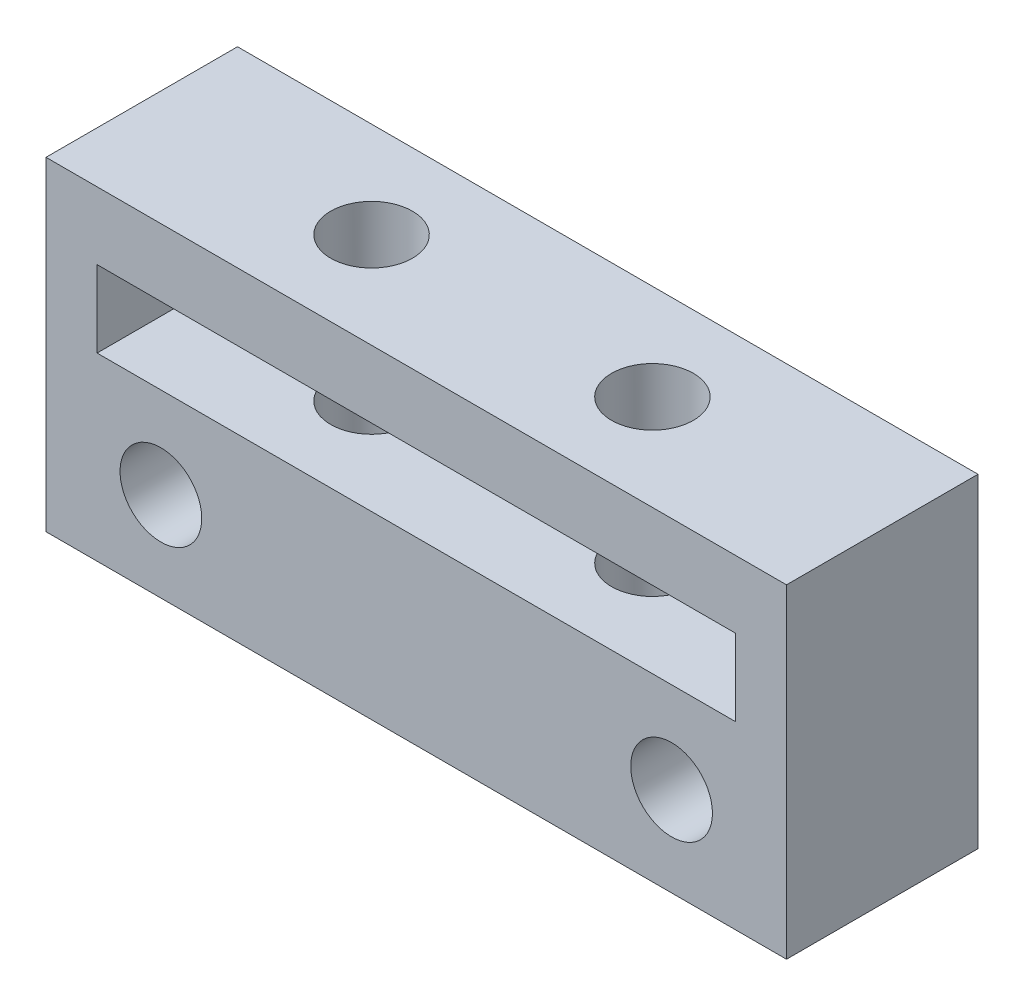
ISO-10303-21;
HEADER;
FILE_DESCRIPTION(('STEP AP214'),'2;1');
FILE_NAME('part.step','',(''),(''),'','','');
FILE_SCHEMA(('AUTOMOTIVE_DESIGN { 1 0 10303 214 1 1 1 1 }'));
ENDSEC;
DATA;
#1=APPLICATION_CONTEXT('core data for automotive mechanical design processes');
#2=APPLICATION_PROTOCOL_DEFINITION('international standard','automotive_design',2000,#1);
#3=PRODUCT_CONTEXT('',#1,'mechanical');
#4=PRODUCT('Part','Part','',(#3));
#5=PRODUCT_RELATED_PRODUCT_CATEGORY('part','',(#4));
#6=PRODUCT_DEFINITION_FORMATION('','',#4);
#7=PRODUCT_DEFINITION_CONTEXT('part definition',#1,'design');
#8=PRODUCT_DEFINITION('design','',#6,#7);
#9=PRODUCT_DEFINITION_SHAPE('','',#8);
#10=(LENGTH_UNIT() NAMED_UNIT(*) SI_UNIT(.MILLI.,.METRE.));
#11=(NAMED_UNIT(*) PLANE_ANGLE_UNIT() SI_UNIT($,.RADIAN.));
#12=(NAMED_UNIT(*) SI_UNIT($,.STERADIAN.) SOLID_ANGLE_UNIT());
#13=UNCERTAINTY_MEASURE_WITH_UNIT(LENGTH_MEASURE(1.E-05),#10,'distance_accuracy_value','');
#14=(GEOMETRIC_REPRESENTATION_CONTEXT(3) GLOBAL_UNCERTAINTY_ASSIGNED_CONTEXT((#13)) GLOBAL_UNIT_ASSIGNED_CONTEXT((#10,
#11,#12)) REPRESENTATION_CONTEXT('',''));
#15=CARTESIAN_POINT('',(0.,0.,0.));
#16=DIRECTION('',(0.,0.,1.));
#17=DIRECTION('',(1.,0.,0.));
#18=AXIS2_PLACEMENT_3D('',#15,#16,#17);
#19=CARTESIAN_POINT('',(5.5,9.6,3.75));
#20=DIRECTION('',(0.,-1.,0.));
#21=DIRECTION('',(0.,0.,-1.));
#22=AXIS2_PLACEMENT_3D('',#19,#20,#21);
#23=CYLINDRICAL_SURFACE('',#22,1.6);
#24=CARTESIAN_POINT('',(5.5,-2.53948169979873,3.75));
#25=DIRECTION('',(0.,-1.,0.));
#26=DIRECTION('',(0.,0.,-1.));
#27=AXIS2_PLACEMENT_3D('',#24,#25,#26);
#28=CIRCLE('',#27,1.6);
#29=CARTESIAN_POINT('',(5.5,-2.53948169979873,2.15));
#30=VERTEX_POINT('',#29);
#31=EDGE_CURVE('E134',#30,#30,#28,.T.);
#32=ORIENTED_EDGE('',*,*,#31,.F.);
#33=EDGE_LOOP('',(#32));
#34=FACE_BOUND('',#33,.T.);
#35=CARTESIAN_POINT('',(5.5,-8.1,3.75));
#36=DIRECTION('',(0.,-1.,0.));
#37=DIRECTION('',(0.,0.,-1.));
#38=AXIS2_PLACEMENT_3D('',#35,#36,#37);
#39=CIRCLE('',#38,1.6);
#40=CARTESIAN_POINT('',(5.5,-8.1,2.15));
#41=VERTEX_POINT('',#40);
#42=EDGE_CURVE('E217',#41,#41,#39,.T.);
#43=ORIENTED_EDGE('',*,*,#42,.T.);
#44=EDGE_LOOP('',(#43));
#45=FACE_BOUND('',#44,.T.);
#46=ADVANCED_FACE('F33',(#34,#45),#23,.F.);
#47=CARTESIAN_POINT('',(-5.5,9.6,3.75));
#48=DIRECTION('',(0.,-1.,0.));
#49=DIRECTION('',(0.,0.,-1.));
#50=AXIS2_PLACEMENT_3D('',#47,#48,#49);
#51=CYLINDRICAL_SURFACE('',#50,1.6);
#52=CARTESIAN_POINT('',(-5.5,-2.53948169979873,3.75));
#53=DIRECTION('',(0.,-1.,0.));
#54=DIRECTION('',(0.,0.,-1.));
#55=AXIS2_PLACEMENT_3D('',#52,#53,#54);
#56=CIRCLE('',#55,1.6);
#57=CARTESIAN_POINT('',(-5.5,-2.53948169979873,2.15));
#58=VERTEX_POINT('',#57);
#59=EDGE_CURVE('E133',#58,#58,#56,.T.);
#60=ORIENTED_EDGE('',*,*,#59,.F.);
#61=EDGE_LOOP('',(#60));
#62=FACE_BOUND('',#61,.T.);
#63=CARTESIAN_POINT('',(-5.5,-8.1,3.75));
#64=DIRECTION('',(0.,-1.,0.));
#65=DIRECTION('',(0.,0.,-1.));
#66=AXIS2_PLACEMENT_3D('',#63,#64,#65);
#67=CIRCLE('',#66,1.6);
#68=CARTESIAN_POINT('',(-5.5,-8.1,2.15));
#69=VERTEX_POINT('',#68);
#70=EDGE_CURVE('E208',#69,#69,#67,.T.);
#71=ORIENTED_EDGE('',*,*,#70,.T.);
#72=EDGE_LOOP('',(#71));
#73=FACE_BOUND('',#72,.T.);
#74=ADVANCED_FACE('F257',(#62,#73),#51,.F.);
#75=CARTESIAN_POINT('',(14.5,-9.6,7.5));
#76=DIRECTION('',(-1.,0.,0.));
#77=DIRECTION('',(0.,0.,1.));
#78=AXIS2_PLACEMENT_3D('',#75,#76,#77);
#79=PLANE('',#78);
#80=DIRECTION('',(0.,1.,0.));
#81=VECTOR('',#80,1.);
#82=CARTESIAN_POINT('',(14.5,-9.6,0.));
#83=LINE('',#82,#81);
#84=CARTESIAN_POINT('',(14.5,-9.6,0.));
#85=VERTEX_POINT('',#84);
#86=CARTESIAN_POINT('',(14.5,3.1,0.));
#87=VERTEX_POINT('',#86);
#88=EDGE_CURVE('E120',#85,#87,#83,.T.);
#89=ORIENTED_EDGE('',*,*,#88,.T.);
#90=DIRECTION('',(0.,0.,1.));
#91=VECTOR('',#90,1.);
#92=CARTESIAN_POINT('',(14.5,3.1,0.));
#93=LINE('',#92,#91);
#94=CARTESIAN_POINT('',(14.5,3.1,7.5));
#95=VERTEX_POINT('',#94);
#96=EDGE_CURVE('E50',#87,#95,#93,.T.);
#97=ORIENTED_EDGE('',*,*,#96,.T.);
#98=DIRECTION('',(0.,1.,0.));
#99=VECTOR('',#98,1.);
#100=CARTESIAN_POINT('',(14.5,-9.6,7.5));
#101=LINE('',#100,#99);
#102=CARTESIAN_POINT('',(14.5,-9.6,7.5));
#103=VERTEX_POINT('',#102);
#104=EDGE_CURVE('E122',#103,#95,#101,.T.);
#105=ORIENTED_EDGE('',*,*,#104,.F.);
#106=DIRECTION('',(0.,0.,-1.));
#107=VECTOR('',#106,1.);
#108=CARTESIAN_POINT('',(14.5,-9.6,7.5));
#109=LINE('',#108,#107);
#110=EDGE_CURVE('E42',#103,#85,#109,.T.);
#111=ORIENTED_EDGE('',*,*,#110,.T.);
#112=EDGE_LOOP('',(#89,#97,#105,#111));
#113=FACE_BOUND('',#112,.T.);
#114=ADVANCED_FACE('F35',(#113),#79,.F.);
#115=CARTESIAN_POINT('',(-14.5,-9.6,7.5));
#116=DIRECTION('',(1.,0.,0.));
#117=DIRECTION('',(0.,0.,-1.));
#118=AXIS2_PLACEMENT_3D('',#115,#116,#117);
#119=PLANE('',#118);
#120=DIRECTION('',(0.,-1.,0.));
#121=VECTOR('',#120,1.);
#122=CARTESIAN_POINT('',(-14.5,-9.6,7.5));
#123=LINE('',#122,#121);
#124=CARTESIAN_POINT('',(-14.5,3.1,7.5));
#125=VERTEX_POINT('',#124);
#126=CARTESIAN_POINT('',(-14.5,-9.6,7.5));
#127=VERTEX_POINT('',#126);
#128=EDGE_CURVE('E114',#125,#127,#123,.T.);
#129=ORIENTED_EDGE('',*,*,#128,.F.);
#130=DIRECTION('',(0.,0.,1.));
#131=VECTOR('',#130,1.);
#132=CARTESIAN_POINT('',(-14.5,3.1,0.));
#133=LINE('',#132,#131);
#134=CARTESIAN_POINT('',(-14.5,3.1,0.));
#135=VERTEX_POINT('',#134);
#136=EDGE_CURVE('E101',#135,#125,#133,.T.);
#137=ORIENTED_EDGE('',*,*,#136,.F.);
#138=DIRECTION('',(0.,-1.,0.));
#139=VECTOR('',#138,1.);
#140=CARTESIAN_POINT('',(-14.5,-9.6,0.));
#141=LINE('',#140,#139);
#142=CARTESIAN_POINT('',(-14.5,-9.6,0.));
#143=VERTEX_POINT('',#142);
#144=EDGE_CURVE('E113',#135,#143,#141,.T.);
#145=ORIENTED_EDGE('',*,*,#144,.T.);
#146=DIRECTION('',(0.,0.,-1.));
#147=VECTOR('',#146,1.);
#148=CARTESIAN_POINT('',(-14.5,-9.6,7.5));
#149=LINE('',#148,#147);
#150=EDGE_CURVE('E11',#127,#143,#149,.T.);
#151=ORIENTED_EDGE('',*,*,#150,.F.);
#152=EDGE_LOOP('',(#129,#137,#145,#151));
#153=FACE_BOUND('',#152,.T.);
#154=ADVANCED_FACE('F111',(#153),#119,.F.);
#155=CARTESIAN_POINT('',(-14.5,-9.6,7.5));
#156=DIRECTION('',(0.,1.,0.));
#157=DIRECTION('',(0.,0.,1.));
#158=AXIS2_PLACEMENT_3D('',#155,#156,#157);
#159=PLANE('',#158);
#160=CARTESIAN_POINT('',(5.5,-9.6,3.75));
#161=DIRECTION('',(0.,-1.,0.));
#162=DIRECTION('',(0.,0.,-1.));
#163=AXIS2_PLACEMENT_3D('',#160,#161,#162);
#164=CIRCLE('',#163,2.6);
#165=CARTESIAN_POINT('',(5.5,-9.6,1.15));
#166=VERTEX_POINT('',#165);
#167=EDGE_CURVE('E214',#166,#166,#164,.T.);
#168=ORIENTED_EDGE('',*,*,#167,.F.);
#169=EDGE_LOOP('',(#168));
#170=FACE_BOUND('',#169,.T.);
#171=CARTESIAN_POINT('',(-5.5,-9.6,3.75));
#172=DIRECTION('',(0.,-1.,0.));
#173=DIRECTION('',(0.,0.,-1.));
#174=AXIS2_PLACEMENT_3D('',#171,#172,#173);
#175=CIRCLE('',#174,2.6);
#176=CARTESIAN_POINT('',(-5.5,-9.6,1.15));
#177=VERTEX_POINT('',#176);
#178=EDGE_CURVE('E205',#177,#177,#175,.T.);
#179=ORIENTED_EDGE('',*,*,#178,.F.);
#180=EDGE_LOOP('',(#179));
#181=FACE_BOUND('',#180,.T.);
#182=DIRECTION('',(1.,0.,0.));
#183=VECTOR('',#182,1.);
#184=CARTESIAN_POINT('',(-14.5,-9.6,0.));
#185=LINE('',#184,#183);
#186=EDGE_CURVE('E119',#143,#85,#185,.T.);
#187=ORIENTED_EDGE('',*,*,#186,.T.);
#188=ORIENTED_EDGE('',*,*,#110,.F.);
#189=DIRECTION('',(1.,0.,0.));
#190=VECTOR('',#189,1.);
#191=CARTESIAN_POINT('',(-14.5,-9.6,7.5));
#192=LINE('',#191,#190);
#193=EDGE_CURVE('E129',#127,#103,#192,.T.);
#194=ORIENTED_EDGE('',*,*,#193,.F.);
#195=ORIENTED_EDGE('',*,*,#150,.T.);
#196=EDGE_LOOP('',(#187,#188,#194,#195));
#197=FACE_BOUND('',#196,.T.);
#198=ADVANCED_FACE('F200',(#170,#181,#197),#159,.F.);
#199=CARTESIAN_POINT('',(0.,0.,7.5));
#200=DIRECTION('',(0.,0.,-1.));
#201=DIRECTION('',(-1.,0.,0.));
#202=AXIS2_PLACEMENT_3D('',#199,#200,#201);
#203=PLANE('',#202);
#204=DIRECTION('',(-1.,0.,0.));
#205=VECTOR('',#204,1.);
#206=CARTESIAN_POINT('',(-12.5,0.460518300201272,7.5));
#207=LINE('',#206,#205);
#208=CARTESIAN_POINT('',(12.5,0.460518300201272,7.5));
#209=VERTEX_POINT('',#208);
#210=CARTESIAN_POINT('',(-12.5,0.460518300201272,7.5));
#211=VERTEX_POINT('',#210);
#212=EDGE_CURVE('E166',#209,#211,#207,.T.);
#213=ORIENTED_EDGE('',*,*,#212,.F.);
#214=DIRECTION('',(0.,1.,0.));
#215=VECTOR('',#214,1.);
#216=CARTESIAN_POINT('',(12.5,0.460518300201272,7.5));
#217=LINE('',#216,#215);
#218=CARTESIAN_POINT('',(12.5,-2.53948169979873,7.5));
#219=VERTEX_POINT('',#218);
#220=EDGE_CURVE('E58',#219,#209,#217,.T.);
#221=ORIENTED_EDGE('',*,*,#220,.F.);
#222=DIRECTION('',(1.,0.,0.));
#223=VECTOR('',#222,1.);
#224=CARTESIAN_POINT('',(-12.5,-2.53948169979873,7.5));
#225=LINE('',#224,#223);
#226=CARTESIAN_POINT('',(-12.5,-2.53948169979873,7.5));
#227=VERTEX_POINT('',#226);
#228=EDGE_CURVE('E155',#227,#219,#225,.T.);
#229=ORIENTED_EDGE('',*,*,#228,.F.);
#230=DIRECTION('',(0.,-1.,0.));
#231=VECTOR('',#230,1.);
#232=CARTESIAN_POINT('',(-12.5,0.460518300201272,7.5));
#233=LINE('',#232,#231);
#234=EDGE_CURVE('E169',#211,#227,#233,.T.);
#235=ORIENTED_EDGE('',*,*,#234,.F.);
#236=EDGE_LOOP('',(#213,#221,#229,#235));
#237=FACE_BOUND('',#236,.T.);
#238=CARTESIAN_POINT('',(-10.,-6.1,7.5));
#239=DIRECTION('',(0.,0.,1.));
#240=DIRECTION('',(1.,0.,0.));
#241=AXIS2_PLACEMENT_3D('',#238,#239,#240);
#242=CIRCLE('',#241,1.6);
#243=CARTESIAN_POINT('',(-8.4,-6.1,7.5));
#244=VERTEX_POINT('',#243);
#245=EDGE_CURVE('E176',#244,#244,#242,.T.);
#246=ORIENTED_EDGE('',*,*,#245,.F.);
#247=EDGE_LOOP('',(#246));
#248=FACE_BOUND('',#247,.T.);
#249=CARTESIAN_POINT('',(10.,-6.1,7.5));
#250=DIRECTION('',(0.,0.,1.));
#251=DIRECTION('',(1.,0.,0.));
#252=AXIS2_PLACEMENT_3D('',#249,#250,#251);
#253=CIRCLE('',#252,1.6);
#254=CARTESIAN_POINT('',(11.6,-6.1,7.5));
#255=VERTEX_POINT('',#254);
#256=EDGE_CURVE('E185',#255,#255,#253,.T.);
#257=ORIENTED_EDGE('',*,*,#256,.F.);
#258=EDGE_LOOP('',(#257));
#259=FACE_BOUND('',#258,.T.);
#260=ORIENTED_EDGE('',*,*,#104,.T.);
#261=DIRECTION('',(1.,0.,0.));
#262=VECTOR('',#261,1.);
#263=CARTESIAN_POINT('',(-14.5,3.1,7.5));
#264=LINE('',#263,#262);
#265=EDGE_CURVE('E107',#125,#95,#264,.T.);
#266=ORIENTED_EDGE('',*,*,#265,.F.);
#267=ORIENTED_EDGE('',*,*,#128,.T.);
#268=ORIENTED_EDGE('',*,*,#193,.T.);
#269=EDGE_LOOP('',(#260,#266,#267,#268));
#270=FACE_BOUND('',#269,.T.);
#271=ADVANCED_FACE('F197',(#237,#248,#259,#270),#203,.F.);
#272=CARTESIAN_POINT('',(0.,0.,0.));
#273=DIRECTION('',(0.,0.,-1.));
#274=DIRECTION('',(-1.,0.,0.));
#275=AXIS2_PLACEMENT_3D('',#272,#273,#274);
#276=PLANE('',#275);
#277=DIRECTION('',(1.,0.,0.));
#278=VECTOR('',#277,1.);
#279=CARTESIAN_POINT('',(-14.5,3.1,0.));
#280=LINE('',#279,#278);
#281=EDGE_CURVE('E97',#135,#87,#280,.T.);
#282=ORIENTED_EDGE('',*,*,#281,.T.);
#283=ORIENTED_EDGE('',*,*,#88,.F.);
#284=ORIENTED_EDGE('',*,*,#186,.F.);
#285=ORIENTED_EDGE('',*,*,#144,.F.);
#286=EDGE_LOOP('',(#282,#283,#284,#285));
#287=FACE_BOUND('',#286,.T.);
#288=DIRECTION('',(0.,1.,0.));
#289=VECTOR('',#288,1.);
#290=CARTESIAN_POINT('',(12.5,0.460518300201272,0.));
#291=LINE('',#290,#289);
#292=CARTESIAN_POINT('',(12.5,-2.53948169979873,0.));
#293=VERTEX_POINT('',#292);
#294=CARTESIAN_POINT('',(12.5,0.460518300201272,0.));
#295=VERTEX_POINT('',#294);
#296=EDGE_CURVE('E151',#293,#295,#291,.T.);
#297=ORIENTED_EDGE('',*,*,#296,.T.);
#298=DIRECTION('',(-1.,0.,0.));
#299=VECTOR('',#298,1.);
#300=CARTESIAN_POINT('',(-12.5,0.460518300201272,0.));
#301=LINE('',#300,#299);
#302=CARTESIAN_POINT('',(-12.5,0.460518300201272,0.));
#303=VERTEX_POINT('',#302);
#304=EDGE_CURVE('E154',#295,#303,#301,.T.);
#305=ORIENTED_EDGE('',*,*,#304,.T.);
#306=DIRECTION('',(0.,-1.,0.));
#307=VECTOR('',#306,1.);
#308=CARTESIAN_POINT('',(-12.5,0.460518300201272,0.));
#309=LINE('',#308,#307);
#310=CARTESIAN_POINT('',(-12.5,-2.53948169979873,0.));
#311=VERTEX_POINT('',#310);
#312=EDGE_CURVE('E158',#303,#311,#309,.T.);
#313=ORIENTED_EDGE('',*,*,#312,.T.);
#314=DIRECTION('',(1.,0.,0.));
#315=VECTOR('',#314,1.);
#316=CARTESIAN_POINT('',(-12.5,-2.53948169979873,0.));
#317=LINE('',#316,#315);
#318=EDGE_CURVE('E161',#311,#293,#317,.T.);
#319=ORIENTED_EDGE('',*,*,#318,.T.);
#320=EDGE_LOOP('',(#297,#305,#313,#319));
#321=FACE_BOUND('',#320,.T.);
#322=CARTESIAN_POINT('',(-10.,-6.1,0.));
#323=DIRECTION('',(0.,0.,1.));
#324=DIRECTION('',(1.,0.,0.));
#325=AXIS2_PLACEMENT_3D('',#322,#323,#324);
#326=CIRCLE('',#325,1.6);
#327=CARTESIAN_POINT('',(-8.4,-6.1,0.));
#328=VERTEX_POINT('',#327);
#329=EDGE_CURVE('E182',#328,#328,#326,.T.);
#330=ORIENTED_EDGE('',*,*,#329,.T.);
#331=EDGE_LOOP('',(#330));
#332=FACE_BOUND('',#331,.T.);
#333=CARTESIAN_POINT('',(10.,-6.1,0.));
#334=DIRECTION('',(0.,0.,1.));
#335=DIRECTION('',(1.,0.,0.));
#336=AXIS2_PLACEMENT_3D('',#333,#334,#335);
#337=CIRCLE('',#336,1.6);
#338=CARTESIAN_POINT('',(11.6,-6.1,0.));
#339=VERTEX_POINT('',#338);
#340=EDGE_CURVE('E124',#339,#339,#337,.T.);
#341=ORIENTED_EDGE('',*,*,#340,.T.);
#342=EDGE_LOOP('',(#341));
#343=FACE_BOUND('',#342,.T.);
#344=ADVANCED_FACE('F117',(#287,#321,#332,#343),#276,.T.);
#345=CARTESIAN_POINT('',(10.,-6.1,0.));
#346=DIRECTION('',(0.,0.,1.));
#347=DIRECTION('',(1.,0.,0.));
#348=AXIS2_PLACEMENT_3D('',#345,#346,#347);
#349=CYLINDRICAL_SURFACE('',#348,1.6);
#350=ORIENTED_EDGE('',*,*,#340,.F.);
#351=EDGE_LOOP('',(#350));
#352=FACE_BOUND('',#351,.T.);
#353=ORIENTED_EDGE('',*,*,#256,.T.);
#354=EDGE_LOOP('',(#353));
#355=FACE_BOUND('',#354,.T.);
#356=ADVANCED_FACE('F295',(#352,#355),#349,.F.);
#357=CARTESIAN_POINT('',(-10.,-6.1,0.));
#358=DIRECTION('',(0.,0.,1.));
#359=DIRECTION('',(1.,0.,0.));
#360=AXIS2_PLACEMENT_3D('',#357,#358,#359);
#361=CYLINDRICAL_SURFACE('',#360,1.6);
#362=ORIENTED_EDGE('',*,*,#329,.F.);
#363=EDGE_LOOP('',(#362));
#364=FACE_BOUND('',#363,.T.);
#365=ORIENTED_EDGE('',*,*,#245,.T.);
#366=EDGE_LOOP('',(#365));
#367=FACE_BOUND('',#366,.T.);
#368=ADVANCED_FACE('F292',(#364,#367),#361,.F.);
#369=CARTESIAN_POINT('',(12.5,0.460518300201272,0.));
#370=DIRECTION('',(1.,0.,0.));
#371=DIRECTION('',(0.,0.,-1.));
#372=AXIS2_PLACEMENT_3D('',#369,#370,#371);
#373=PLANE('',#372);
#374=ORIENTED_EDGE('',*,*,#220,.T.);
#375=DIRECTION('',(0.,0.,1.));
#376=VECTOR('',#375,1.);
#377=CARTESIAN_POINT('',(12.5,0.460518300201272,0.));
#378=LINE('',#377,#376);
#379=EDGE_CURVE('E164',#295,#209,#378,.T.);
#380=ORIENTED_EDGE('',*,*,#379,.F.);
#381=ORIENTED_EDGE('',*,*,#296,.F.);
#382=DIRECTION('',(0.,0.,1.));
#383=VECTOR('',#382,1.);
#384=CARTESIAN_POINT('',(12.5,-2.53948169979873,0.));
#385=LINE('',#384,#383);
#386=EDGE_CURVE('E174',#293,#219,#385,.T.);
#387=ORIENTED_EDGE('',*,*,#386,.T.);
#388=EDGE_LOOP('',(#374,#380,#381,#387));
#389=FACE_BOUND('',#388,.T.);
#390=ADVANCED_FACE('F285',(#389),#373,.F.);
#391=CARTESIAN_POINT('',(-12.5,-2.53948169979873,0.));
#392=DIRECTION('',(0.,-1.,0.));
#393=DIRECTION('',(0.,0.,-1.));
#394=AXIS2_PLACEMENT_3D('',#391,#392,#393);
#395=PLANE('',#394);
#396=ORIENTED_EDGE('',*,*,#31,.T.);
#397=EDGE_LOOP('',(#396));
#398=FACE_BOUND('',#397,.T.);
#399=ORIENTED_EDGE('',*,*,#59,.T.);
#400=EDGE_LOOP('',(#399));
#401=FACE_BOUND('',#400,.T.);
#402=ORIENTED_EDGE('',*,*,#228,.T.);
#403=ORIENTED_EDGE('',*,*,#386,.F.);
#404=ORIENTED_EDGE('',*,*,#318,.F.);
#405=DIRECTION('',(0.,0.,1.));
#406=VECTOR('',#405,1.);
#407=CARTESIAN_POINT('',(-12.5,-2.53948169979873,0.));
#408=LINE('',#407,#406);
#409=EDGE_CURVE('E177',#311,#227,#408,.T.);
#410=ORIENTED_EDGE('',*,*,#409,.T.);
#411=EDGE_LOOP('',(#402,#403,#404,#410));
#412=FACE_BOUND('',#411,.T.);
#413=ADVANCED_FACE('F282',(#398,#401,#412),#395,.F.);
#414=CARTESIAN_POINT('',(-12.5,0.460518300201272,0.));
#415=DIRECTION('',(-1.,0.,0.));
#416=DIRECTION('',(0.,0.,1.));
#417=AXIS2_PLACEMENT_3D('',#414,#415,#416);
#418=PLANE('',#417);
#419=ORIENTED_EDGE('',*,*,#234,.T.);
#420=ORIENTED_EDGE('',*,*,#409,.F.);
#421=ORIENTED_EDGE('',*,*,#312,.F.);
#422=DIRECTION('',(0.,0.,1.));
#423=VECTOR('',#422,1.);
#424=CARTESIAN_POINT('',(-12.5,0.460518300201272,0.));
#425=LINE('',#424,#423);
#426=EDGE_CURVE('E179',#303,#211,#425,.T.);
#427=ORIENTED_EDGE('',*,*,#426,.T.);
#428=EDGE_LOOP('',(#419,#420,#421,#427));
#429=FACE_BOUND('',#428,.T.);
#430=ADVANCED_FACE('F278',(#429),#418,.F.);
#431=CARTESIAN_POINT('',(-12.5,0.460518300201272,0.));
#432=DIRECTION('',(0.,1.,0.));
#433=DIRECTION('',(0.,0.,1.));
#434=AXIS2_PLACEMENT_3D('',#431,#432,#433);
#435=PLANE('',#434);
#436=CARTESIAN_POINT('',(5.5,0.460518300201272,3.75));
#437=DIRECTION('',(0.,1.,0.));
#438=DIRECTION('',(0.,0.,1.));
#439=AXIS2_PLACEMENT_3D('',#436,#437,#438);
#440=CIRCLE('',#439,1.6);
#441=CARTESIAN_POINT('',(5.5,0.460518300201272,5.35));
#442=VERTEX_POINT('',#441);
#443=EDGE_CURVE('E135',#442,#442,#440,.T.);
#444=ORIENTED_EDGE('',*,*,#443,.T.);
#445=EDGE_LOOP('',(#444));
#446=FACE_BOUND('',#445,.T.);
#447=CARTESIAN_POINT('',(-5.5,0.460518300201272,3.75));
#448=DIRECTION('',(0.,1.,0.));
#449=DIRECTION('',(0.,0.,1.));
#450=AXIS2_PLACEMENT_3D('',#447,#448,#449);
#451=CIRCLE('',#450,1.6);
#452=CARTESIAN_POINT('',(-5.5,0.460518300201272,5.35));
#453=VERTEX_POINT('',#452);
#454=EDGE_CURVE('E131',#453,#453,#451,.T.);
#455=ORIENTED_EDGE('',*,*,#454,.T.);
#456=EDGE_LOOP('',(#455));
#457=FACE_BOUND('',#456,.T.);
#458=ORIENTED_EDGE('',*,*,#212,.T.);
#459=ORIENTED_EDGE('',*,*,#426,.F.);
#460=ORIENTED_EDGE('',*,*,#304,.F.);
#461=ORIENTED_EDGE('',*,*,#379,.T.);
#462=EDGE_LOOP('',(#458,#459,#460,#461));
#463=FACE_BOUND('',#462,.T.);
#464=ADVANCED_FACE('F272',(#446,#457,#463),#435,.F.);
#465=CARTESIAN_POINT('',(-5.5,3.1,3.75));
#466=DIRECTION('',(0.,-1.,0.));
#467=DIRECTION('',(0.,0.,-1.));
#468=AXIS2_PLACEMENT_3D('',#465,#466,#467);
#469=CIRCLE('',#468,1.6);
#470=CARTESIAN_POINT('',(-5.5,3.1,2.15));
#471=VERTEX_POINT('',#470);
#472=EDGE_CURVE('E137',#471,#471,#469,.F.);
#473=ORIENTED_EDGE('',*,*,#472,.T.);
#474=EDGE_LOOP('',(#473));
#475=FACE_BOUND('',#474,.T.);
#476=ORIENTED_EDGE('',*,*,#454,.F.);
#477=EDGE_LOOP('',(#476));
#478=FACE_BOUND('',#477,.T.);
#479=ADVANCED_FACE('F265',(#475,#478),#51,.F.);
#480=CARTESIAN_POINT('',(5.5,3.1,3.75));
#481=DIRECTION('',(0.,-1.,0.));
#482=DIRECTION('',(0.,0.,-1.));
#483=AXIS2_PLACEMENT_3D('',#480,#481,#482);
#484=CIRCLE('',#483,1.6);
#485=CARTESIAN_POINT('',(5.5,3.1,2.15));
#486=VERTEX_POINT('',#485);
#487=EDGE_CURVE('E37',#486,#486,#484,.F.);
#488=ORIENTED_EDGE('',*,*,#487,.T.);
#489=EDGE_LOOP('',(#488));
#490=FACE_BOUND('',#489,.T.);
#491=ORIENTED_EDGE('',*,*,#443,.F.);
#492=EDGE_LOOP('',(#491));
#493=FACE_BOUND('',#492,.T.);
#494=ADVANCED_FACE('F252',(#490,#493),#23,.F.);
#495=CARTESIAN_POINT('',(-14.5,3.1,0.));
#496=DIRECTION('',(0.,-1.,0.));
#497=DIRECTION('',(0.,0.,-1.));
#498=AXIS2_PLACEMENT_3D('',#495,#496,#497);
#499=PLANE('',#498);
#500=ORIENTED_EDGE('',*,*,#487,.F.);
#501=EDGE_LOOP('',(#500));
#502=FACE_BOUND('',#501,.T.);
#503=ORIENTED_EDGE('',*,*,#265,.T.);
#504=ORIENTED_EDGE('',*,*,#96,.F.);
#505=ORIENTED_EDGE('',*,*,#281,.F.);
#506=ORIENTED_EDGE('',*,*,#136,.T.);
#507=EDGE_LOOP('',(#503,#504,#505,#506));
#508=FACE_BOUND('',#507,.T.);
#509=ORIENTED_EDGE('',*,*,#472,.F.);
#510=EDGE_LOOP('',(#509));
#511=FACE_BOUND('',#510,.T.);
#512=ADVANCED_FACE('F99',(#502,#508,#511),#499,.F.);
#513=CARTESIAN_POINT('',(-5.5,-8.1,3.75));
#514=DIRECTION('',(0.,-1.,0.));
#515=DIRECTION('',(0.,0.,-1.));
#516=AXIS2_PLACEMENT_3D('',#513,#514,#515);
#517=CYLINDRICAL_SURFACE('',#516,2.6);
#518=CARTESIAN_POINT('',(-5.5,-8.1,3.75));
#519=DIRECTION('',(0.,-1.,0.));
#520=DIRECTION('',(0.,0.,-1.));
#521=AXIS2_PLACEMENT_3D('',#518,#519,#520);
#522=CIRCLE('',#521,2.6);
#523=CARTESIAN_POINT('',(-5.5,-8.1,1.15));
#524=VERTEX_POINT('',#523);
#525=EDGE_CURVE('E203',#524,#524,#522,.T.);
#526=ORIENTED_EDGE('',*,*,#525,.F.);
#527=EDGE_LOOP('',(#526));
#528=FACE_BOUND('',#527,.T.);
#529=ORIENTED_EDGE('',*,*,#178,.T.);
#530=EDGE_LOOP('',(#529));
#531=FACE_BOUND('',#530,.T.);
#532=ADVANCED_FACE('F242',(#528,#531),#517,.F.);
#533=CARTESIAN_POINT('',(-5.5,-8.1,3.75));
#534=DIRECTION('',(0.,-1.,0.));
#535=DIRECTION('',(0.,0.,-1.));
#536=AXIS2_PLACEMENT_3D('',#533,#534,#535);
#537=PLANE('',#536);
#538=ORIENTED_EDGE('',*,*,#70,.F.);
#539=EDGE_LOOP('',(#538));
#540=FACE_BOUND('',#539,.T.);
#541=ORIENTED_EDGE('',*,*,#525,.T.);
#542=EDGE_LOOP('',(#541));
#543=FACE_BOUND('',#542,.T.);
#544=ADVANCED_FACE('F233',(#540,#543),#537,.T.);
#545=CARTESIAN_POINT('',(5.5,-8.1,3.75));
#546=DIRECTION('',(0.,-1.,0.));
#547=DIRECTION('',(0.,0.,-1.));
#548=AXIS2_PLACEMENT_3D('',#545,#546,#547);
#549=CYLINDRICAL_SURFACE('',#548,2.6);
#550=CARTESIAN_POINT('',(5.5,-8.1,3.75));
#551=DIRECTION('',(0.,-1.,0.));
#552=DIRECTION('',(0.,0.,-1.));
#553=AXIS2_PLACEMENT_3D('',#550,#551,#552);
#554=CIRCLE('',#553,2.6);
#555=CARTESIAN_POINT('',(5.5,-8.1,1.15));
#556=VERTEX_POINT('',#555);
#557=EDGE_CURVE('E213',#556,#556,#554,.T.);
#558=ORIENTED_EDGE('',*,*,#557,.F.);
#559=EDGE_LOOP('',(#558));
#560=FACE_BOUND('',#559,.T.);
#561=ORIENTED_EDGE('',*,*,#167,.T.);
#562=EDGE_LOOP('',(#561));
#563=FACE_BOUND('',#562,.T.);
#564=ADVANCED_FACE('F227',(#560,#563),#549,.F.);
#565=CARTESIAN_POINT('',(5.5,-8.1,3.75));
#566=DIRECTION('',(0.,-1.,0.));
#567=DIRECTION('',(0.,0.,-1.));
#568=AXIS2_PLACEMENT_3D('',#565,#566,#567);
#569=PLANE('',#568);
#570=ORIENTED_EDGE('',*,*,#42,.F.);
#571=EDGE_LOOP('',(#570));
#572=FACE_BOUND('',#571,.T.);
#573=ORIENTED_EDGE('',*,*,#557,.T.);
#574=EDGE_LOOP('',(#573));
#575=FACE_BOUND('',#574,.T.);
#576=ADVANCED_FACE('F224',(#572,#575),#569,.T.);
#577=CLOSED_SHELL('',(#46,#74,#114,#154,#198,#271,#344,#356,#368,#390,#413,#430,#464,#479,#494,
#512,#532,#544,#564,#576));
#578=MANIFOLD_SOLID_BREP('B2',#577);
#579=ADVANCED_BREP_SHAPE_REPRESENTATION('',(#18,#578),#14);
#580=SHAPE_DEFINITION_REPRESENTATION(#9,#579);
ENDSEC;
END-ISO-10303-21;
